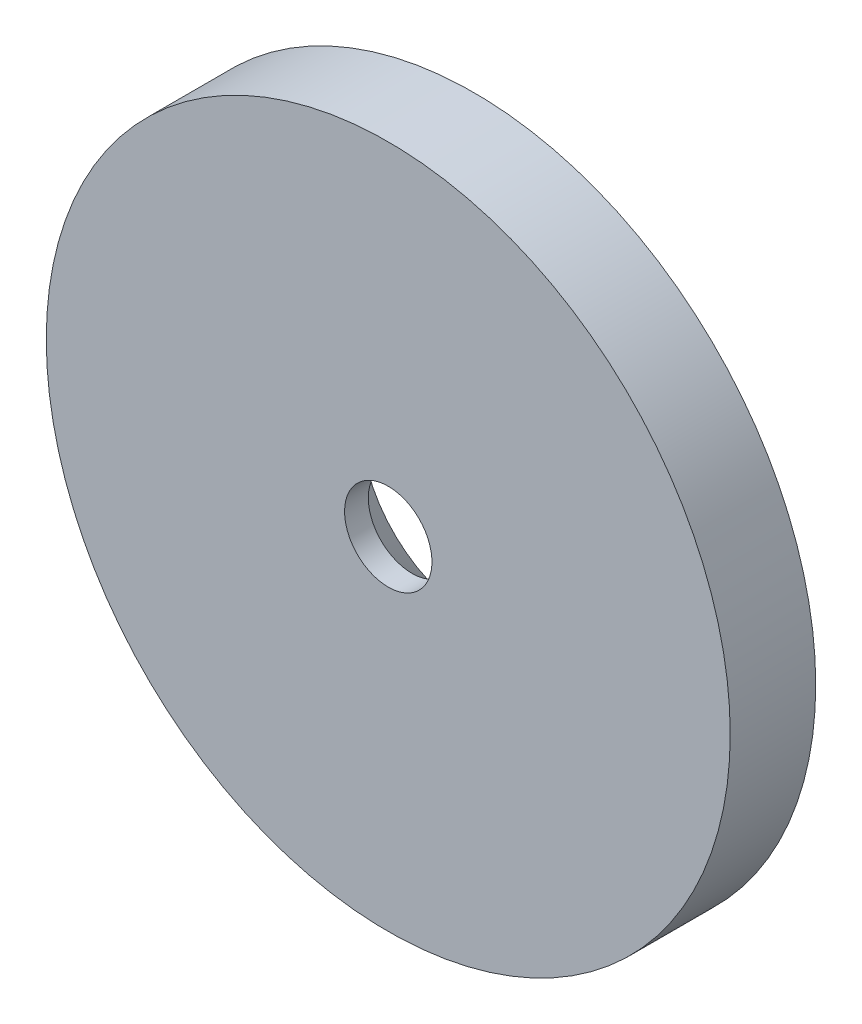
ISO-10303-21;
HEADER;
FILE_DESCRIPTION(('STEP AP214'),'2;1');
FILE_NAME('part.step','',(''),(''),'','','');
FILE_SCHEMA(('AUTOMOTIVE_DESIGN { 1 0 10303 214 1 1 1 1 }'));
ENDSEC;
DATA;
#1=APPLICATION_CONTEXT('core data for automotive mechanical design processes');
#2=APPLICATION_PROTOCOL_DEFINITION('international standard','automotive_design',2000,#1);
#3=PRODUCT_CONTEXT('',#1,'mechanical');
#4=PRODUCT('Part','Part','',(#3));
#5=PRODUCT_RELATED_PRODUCT_CATEGORY('part','',(#4));
#6=PRODUCT_DEFINITION_FORMATION('','',#4);
#7=PRODUCT_DEFINITION_CONTEXT('part definition',#1,'design');
#8=PRODUCT_DEFINITION('design','',#6,#7);
#9=PRODUCT_DEFINITION_SHAPE('','',#8);
#10=(LENGTH_UNIT() NAMED_UNIT(*) SI_UNIT(.MILLI.,.METRE.));
#11=(NAMED_UNIT(*) PLANE_ANGLE_UNIT() SI_UNIT($,.RADIAN.));
#12=(NAMED_UNIT(*) SI_UNIT($,.STERADIAN.) SOLID_ANGLE_UNIT());
#13=UNCERTAINTY_MEASURE_WITH_UNIT(LENGTH_MEASURE(1.E-05),#10,'distance_accuracy_value','');
#14=(GEOMETRIC_REPRESENTATION_CONTEXT(3) GLOBAL_UNCERTAINTY_ASSIGNED_CONTEXT((#13)) GLOBAL_UNIT_ASSIGNED_CONTEXT((#10,
#11,#12)) REPRESENTATION_CONTEXT('',''));
#15=CARTESIAN_POINT('',(0.,0.,0.));
#16=DIRECTION('',(0.,0.,1.));
#17=DIRECTION('',(1.,0.,0.));
#18=AXIS2_PLACEMENT_3D('',#15,#16,#17);
#19=CARTESIAN_POINT('',(0.,0.,2.286));
#20=DIRECTION('',(0.,0.,-1.));
#21=DIRECTION('',(-1.,0.,0.));
#22=AXIS2_PLACEMENT_3D('',#19,#20,#21);
#23=CYLINDRICAL_SURFACE('',#22,9.144);
#24=CARTESIAN_POINT('',(0.,0.,2.286));
#25=DIRECTION('',(0.,0.,1.));
#26=DIRECTION('',(1.,0.,0.));
#27=AXIS2_PLACEMENT_3D('',#24,#25,#26);
#28=CIRCLE('',#27,9.144);
#29=CARTESIAN_POINT('',(9.144,0.,2.286));
#30=VERTEX_POINT('',#29);
#31=EDGE_CURVE('E10',#30,#30,#28,.T.);
#32=ORIENTED_EDGE('',*,*,#31,.F.);
#33=EDGE_LOOP('',(#32));
#34=FACE_BOUND('',#33,.T.);
#35=CARTESIAN_POINT('',(0.,0.,0.));
#36=DIRECTION('',(0.,0.,1.));
#37=DIRECTION('',(1.,0.,0.));
#38=AXIS2_PLACEMENT_3D('',#35,#36,#37);
#39=CIRCLE('',#38,9.144);
#40=CARTESIAN_POINT('',(9.144,0.,0.));
#41=VERTEX_POINT('',#40);
#42=EDGE_CURVE('E37',#41,#41,#39,.T.);
#43=ORIENTED_EDGE('',*,*,#42,.T.);
#44=EDGE_LOOP('',(#43));
#45=FACE_BOUND('',#44,.T.);
#46=ADVANCED_FACE('F34',(#34,#45),#23,.T.);
#47=CARTESIAN_POINT('',(0.,0.,2.286));
#48=DIRECTION('',(0.,0.,1.));
#49=DIRECTION('',(1.,0.,0.));
#50=AXIS2_PLACEMENT_3D('',#47,#48,#49);
#51=PLANE('',#50);
#52=CARTESIAN_POINT('',(0.,0.,2.286));
#53=DIRECTION('',(0.,0.,-1.));
#54=DIRECTION('',(-1.,0.,0.));
#55=AXIS2_PLACEMENT_3D('',#52,#53,#54);
#56=CIRCLE('',#55,1.1684);
#57=CARTESIAN_POINT('',(-1.1684,0.,2.286));
#58=VERTEX_POINT('',#57);
#59=EDGE_CURVE('E44',#58,#58,#56,.T.);
#60=ORIENTED_EDGE('',*,*,#59,.T.);
#61=EDGE_LOOP('',(#60));
#62=FACE_BOUND('',#61,.T.);
#63=ORIENTED_EDGE('',*,*,#31,.T.);
#64=EDGE_LOOP('',(#63));
#65=FACE_BOUND('',#64,.T.);
#66=ADVANCED_FACE('F67',(#62,#65),#51,.T.);
#67=CARTESIAN_POINT('',(0.,0.,0.));
#68=DIRECTION('',(0.,0.,1.));
#69=DIRECTION('',(1.,0.,0.));
#70=AXIS2_PLACEMENT_3D('',#67,#68,#69);
#71=PLANE('',#70);
#72=CARTESIAN_POINT('',(0.,0.,0.));
#73=DIRECTION('',(0.,0.,-1.));
#74=DIRECTION('',(-1.,0.,0.));
#75=AXIS2_PLACEMENT_3D('',#72,#73,#74);
#76=CIRCLE('',#75,3.01625);
#77=CARTESIAN_POINT('',(-3.01625,0.,0.));
#78=VERTEX_POINT('',#77);
#79=EDGE_CURVE('E57',#78,#78,#76,.T.);
#80=ORIENTED_EDGE('',*,*,#79,.F.);
#81=EDGE_LOOP('',(#80));
#82=FACE_BOUND('',#81,.T.);
#83=ORIENTED_EDGE('',*,*,#42,.F.);
#84=EDGE_LOOP('',(#83));
#85=FACE_BOUND('',#84,.T.);
#86=ADVANCED_FACE('F63',(#82,#85),#71,.F.);
#87=CARTESIAN_POINT('',(0.,0.,0.));
#88=DIRECTION('',(0.,0.,-1.));
#89=DIRECTION('',(-1.,0.,0.));
#90=AXIS2_PLACEMENT_3D('',#87,#88,#89);
#91=CYLINDRICAL_SURFACE('',#90,1.1684);
#92=ORIENTED_EDGE('',*,*,#59,.F.);
#93=EDGE_LOOP('',(#92));
#94=FACE_BOUND('',#93,.T.);
#95=CARTESIAN_POINT('',(0.,0.,1.651));
#96=DIRECTION('',(0.,0.,-1.));
#97=DIRECTION('',(-1.,0.,0.));
#98=AXIS2_PLACEMENT_3D('',#95,#96,#97);
#99=CIRCLE('',#98,1.1684);
#100=CARTESIAN_POINT('',(-1.1684,0.,1.651));
#101=VERTEX_POINT('',#100);
#102=EDGE_CURVE('E48',#101,#101,#99,.T.);
#103=ORIENTED_EDGE('',*,*,#102,.T.);
#104=EDGE_LOOP('',(#103));
#105=FACE_BOUND('',#104,.T.);
#106=ADVANCED_FACE('F66',(#94,#105),#91,.F.);
#107=CARTESIAN_POINT('',(1.651,0.,1.651));
#108=DIRECTION('',(0.,0.,1.));
#109=DIRECTION('',(1.,0.,0.));
#110=AXIS2_PLACEMENT_3D('',#107,#108,#109);
#111=PLANE('',#110);
#112=ORIENTED_EDGE('',*,*,#102,.F.);
#113=EDGE_LOOP('',(#112));
#114=FACE_BOUND('',#113,.T.);
#115=CARTESIAN_POINT('',(0.,0.,1.651));
#116=DIRECTION('',(0.,0.,-1.));
#117=DIRECTION('',(-1.,0.,0.));
#118=AXIS2_PLACEMENT_3D('',#115,#116,#117);
#119=CIRCLE('',#118,1.651);
#120=CARTESIAN_POINT('',(-1.651,0.,1.651));
#121=VERTEX_POINT('',#120);
#122=EDGE_CURVE('E51',#121,#121,#119,.T.);
#123=ORIENTED_EDGE('',*,*,#122,.T.);
#124=EDGE_LOOP('',(#123));
#125=FACE_BOUND('',#124,.T.);
#126=ADVANCED_FACE('F82',(#114,#125),#111,.F.);
#127=CARTESIAN_POINT('',(0.,0.,0.));
#128=DIRECTION('',(0.,0.,-1.));
#129=DIRECTION('',(-1.,0.,0.));
#130=AXIS2_PLACEMENT_3D('',#127,#128,#129);
#131=CYLINDRICAL_SURFACE('',#130,1.651);
#132=ORIENTED_EDGE('',*,*,#122,.F.);
#133=EDGE_LOOP('',(#132));
#134=FACE_BOUND('',#133,.T.);
#135=CARTESIAN_POINT('',(0.,0.,1.36525));
#136=DIRECTION('',(0.,0.,-1.));
#137=DIRECTION('',(-1.,0.,0.));
#138=AXIS2_PLACEMENT_3D('',#135,#136,#137);
#139=CIRCLE('',#138,1.651);
#140=CARTESIAN_POINT('',(-1.651,0.,1.36525));
#141=VERTEX_POINT('',#140);
#142=EDGE_CURVE('E54',#141,#141,#139,.T.);
#143=ORIENTED_EDGE('',*,*,#142,.T.);
#144=EDGE_LOOP('',(#143));
#145=FACE_BOUND('',#144,.T.);
#146=ADVANCED_FACE('F86',(#134,#145),#131,.F.);
#147=CARTESIAN_POINT('',(0.,0.,0.));
#148=DIRECTION('',(0.,0.,-1.));
#149=DIRECTION('',(-1.,0.,0.));
#150=AXIS2_PLACEMENT_3D('',#147,#148,#149);
#151=CONICAL_SURFACE('',#150,3.01625,0.785398163397447);
#152=ORIENTED_EDGE('',*,*,#142,.F.);
#153=EDGE_LOOP('',(#152));
#154=FACE_BOUND('',#153,.T.);
#155=ORIENTED_EDGE('',*,*,#79,.T.);
#156=EDGE_LOOP('',(#155));
#157=FACE_BOUND('',#156,.T.);
#158=ADVANCED_FACE('F61',(#154,#157),#151,.F.);
#159=CLOSED_SHELL('',(#46,#66,#86,#106,#126,#146,#158));
#160=MANIFOLD_SOLID_BREP('B2',#159);
#161=ADVANCED_BREP_SHAPE_REPRESENTATION('',(#18,#160),#14);
#162=SHAPE_DEFINITION_REPRESENTATION(#9,#161);
ENDSEC;
END-ISO-10303-21;
